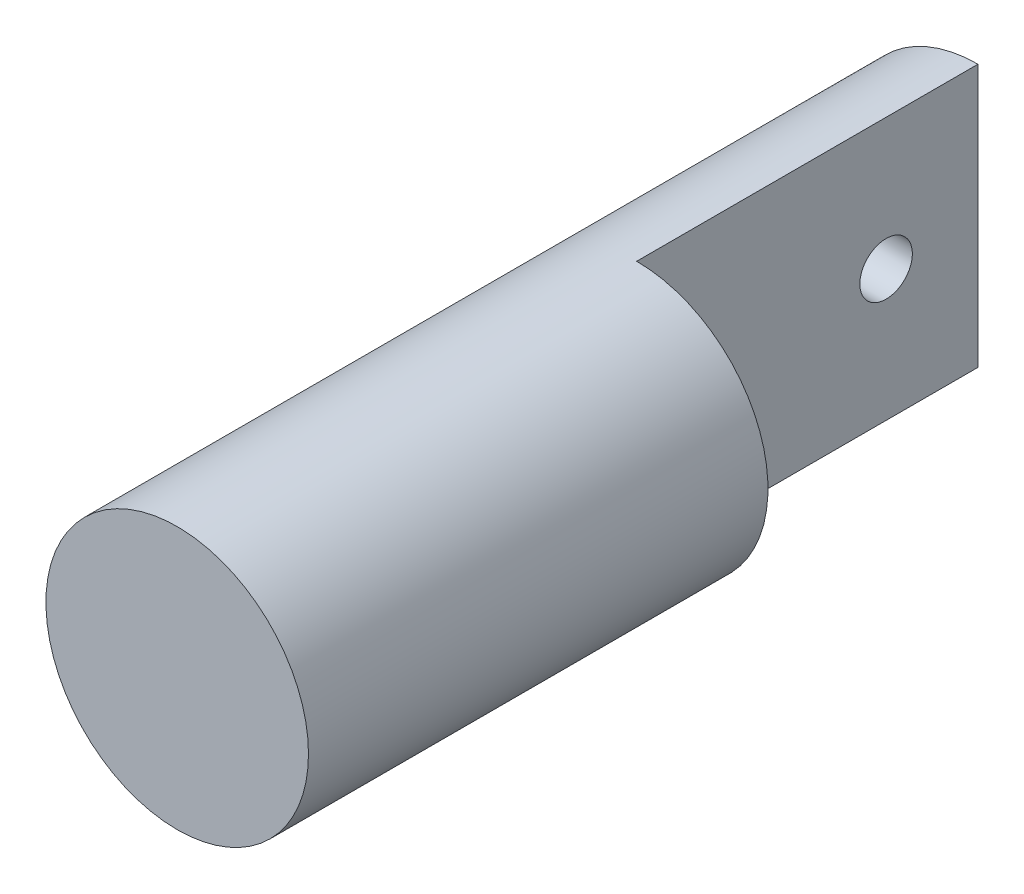
ISO-10303-21;
HEADER;
FILE_DESCRIPTION(('STEP AP214'),'2;1');
FILE_NAME('part.step','',(''),(''),'','','');
FILE_SCHEMA(('AUTOMOTIVE_DESIGN { 1 0 10303 214 1 1 1 1 }'));
ENDSEC;
DATA;
#1=APPLICATION_CONTEXT('core data for automotive mechanical design processes');
#2=APPLICATION_PROTOCOL_DEFINITION('international standard','automotive_design',2000,#1);
#3=PRODUCT_CONTEXT('',#1,'mechanical');
#4=PRODUCT('Part','Part','',(#3));
#5=PRODUCT_RELATED_PRODUCT_CATEGORY('part','',(#4));
#6=PRODUCT_DEFINITION_FORMATION('','',#4);
#7=PRODUCT_DEFINITION_CONTEXT('part definition',#1,'design');
#8=PRODUCT_DEFINITION('design','',#6,#7);
#9=PRODUCT_DEFINITION_SHAPE('','',#8);
#10=(LENGTH_UNIT() NAMED_UNIT(*) SI_UNIT(.MILLI.,.METRE.));
#11=(NAMED_UNIT(*) PLANE_ANGLE_UNIT() SI_UNIT($,.RADIAN.));
#12=(NAMED_UNIT(*) SI_UNIT($,.STERADIAN.) SOLID_ANGLE_UNIT());
#13=UNCERTAINTY_MEASURE_WITH_UNIT(LENGTH_MEASURE(1.E-05),#10,'distance_accuracy_value','');
#14=(GEOMETRIC_REPRESENTATION_CONTEXT(3) GLOBAL_UNCERTAINTY_ASSIGNED_CONTEXT((#13)) GLOBAL_UNIT_ASSIGNED_CONTEXT((#10,
#11,#12)) REPRESENTATION_CONTEXT('',''));
#15=CARTESIAN_POINT('',(0.,0.,0.));
#16=DIRECTION('',(0.,0.,1.));
#17=DIRECTION('',(1.,0.,0.));
#18=AXIS2_PLACEMENT_3D('',#15,#16,#17);
#19=CARTESIAN_POINT('',(0.,0.,0.));
#20=DIRECTION('',(0.,0.,1.));
#21=DIRECTION('',(1.,0.,0.));
#22=AXIS2_PLACEMENT_3D('',#19,#20,#21);
#23=PLANE('',#22);
#24=CARTESIAN_POINT('',(0.,0.,0.));
#25=DIRECTION('',(0.,0.,1.));
#26=DIRECTION('',(1.,0.,0.));
#27=AXIS2_PLACEMENT_3D('',#24,#25,#26);
#28=CIRCLE('',#27,10.);
#29=CARTESIAN_POINT('',(0.,10.,0.));
#30=VERTEX_POINT('',#29);
#31=CARTESIAN_POINT('',(0.,-10.,0.));
#32=VERTEX_POINT('',#31);
#33=EDGE_CURVE('E54',#30,#32,#28,.T.);
#34=ORIENTED_EDGE('',*,*,#33,.F.);
#35=DIRECTION('',(0.,1.,0.));
#36=VECTOR('',#35,1.);
#37=CARTESIAN_POINT('',(0.,10.,0.));
#38=LINE('',#37,#36);
#39=EDGE_CURVE('E71',#32,#30,#38,.T.);
#40=ORIENTED_EDGE('',*,*,#39,.F.);
#41=EDGE_LOOP('',(#34,#40));
#42=FACE_BOUND('',#41,.T.);
#43=CARTESIAN_POINT('',(-5.,0.,0.));
#44=DIRECTION('',(0.,0.,-1.));
#45=DIRECTION('',(-1.,0.,0.));
#46=AXIS2_PLACEMENT_3D('',#43,#44,#45);
#47=CIRCLE('',#46,1.24999999999999);
#48=CARTESIAN_POINT('',(-6.24999999999999,0.,0.));
#49=VERTEX_POINT('',#48);
#50=EDGE_CURVE('E169',#49,#49,#47,.T.);
#51=ORIENTED_EDGE('',*,*,#50,.F.);
#52=EDGE_LOOP('',(#51));
#53=FACE_BOUND('',#52,.T.);
#54=ADVANCED_FACE('F45',(#42,#53),#23,.F.);
#55=CARTESIAN_POINT('',(0.,0.,27.));
#56=DIRECTION('',(0.,0.,-1.));
#57=DIRECTION('',(-1.,0.,0.));
#58=AXIS2_PLACEMENT_3D('',#55,#56,#57);
#59=CYLINDRICAL_SURFACE('',#58,10.);
#60=CARTESIAN_POINT('',(-10.,0.,5.));
#61=CARTESIAN_POINT('',(-9.99999795161742,0.111153813585266,5.00000408899669));
#62=CARTESIAN_POINT('',(-9.99812770356462,0.222359320403045,5.00929768593529));
#63=CARTESIAN_POINT('',(-9.99084731246463,0.441627015378039,5.04619700023049));
#64=CARTESIAN_POINT('',(-9.98543435720372,0.549686635082712,5.07381726560302));
#65=CARTESIAN_POINT('',(-9.97167298556573,0.759460610526626,5.14648254724158));
#66=CARTESIAN_POINT('',(-9.96332738153436,0.861180935866269,5.19151087368938));
#67=CARTESIAN_POINT('',(-9.94460796070629,1.05561597772845,5.29766449502259));
#68=CARTESIAN_POINT('',(-9.93423426471414,1.14833123015162,5.35878883121441));
#69=CARTESIAN_POINT('',(-9.9124433065994,1.32338695462973,5.49627698858287));
#70=CARTESIAN_POINT('',(-9.90101491008695,1.40558790231705,5.5728167107824));
#71=CARTESIAN_POINT('',(-9.87848360905177,1.55607351321606,5.73858483278341));
#72=CARTESIAN_POINT('',(-9.86738073000847,1.62435708954085,5.82781422267024));
#73=CARTESIAN_POINT('',(-9.8466488362523,1.74566350669524,6.01743238602375));
#74=CARTESIAN_POINT('',(-9.83703414729892,1.79854187773173,6.11791528759272));
#75=CARTESIAN_POINT('',(-9.82052536116836,1.88661133316062,6.32656363800816));
#76=CARTESIAN_POINT('',(-9.81363099523923,1.92180416487448,6.43472832669269));
#77=CARTESIAN_POINT('',(-9.80345610504409,1.97305059976965,6.65416872781583));
#78=CARTESIAN_POINT('',(-9.80012940214375,1.98934899591755,6.76538508828445));
#79=CARTESIAN_POINT('',(-9.79732750121254,2.00310425545224,6.98901964272868));
#80=CARTESIAN_POINT('',(-9.79785190935681,2.000563045427,7.10143771264029));
#81=CARTESIAN_POINT('',(-9.80265102296369,1.97690914620364,7.32249357604201));
#82=CARTESIAN_POINT('',(-9.80686905717527,1.95607708048781,7.43116281125463));
#83=CARTESIAN_POINT('',(-9.81849092320002,1.8968757692461,7.64343215332601));
#84=CARTESIAN_POINT('',(-9.82589490715558,1.85850568620136,7.74703201783802));
#85=CARTESIAN_POINT('',(-9.84311237000816,1.76504956734944,7.9470305234072));
#86=CARTESIAN_POINT('',(-9.85294179627409,1.70985230246423,8.04337575913834));
#87=CARTESIAN_POINT('',(-9.87389237546124,1.58438714914536,8.22554169994563));
#88=CARTESIAN_POINT('',(-9.88501367676732,1.51411752871366,8.31136119370231));
#89=CARTESIAN_POINT('',(-9.90754042482924,1.35899986912117,8.47165880491387));
#90=CARTESIAN_POINT('',(-9.9189473842181,1.27391232242489,8.54590513571826));
#91=CARTESIAN_POINT('',(-9.94057697428817,1.09237004812402,8.67910769260245));
#92=CARTESIAN_POINT('',(-9.95079958977947,0.995915174758779,8.73806372258716));
#93=CARTESIAN_POINT('',(-9.96893380321774,0.794118773757842,8.83905501845195));
#94=CARTESIAN_POINT('',(-9.97684177696544,0.688763639170601,8.88106378728907));
#95=CARTESIAN_POINT('',(-9.98942817975716,0.47229795289733,8.94672094807713));
#96=CARTESIAN_POINT('',(-9.99410700001063,0.3611881001449,8.97037156414726));
#97=CARTESIAN_POINT('',(-9.99965343733735,0.138358811254301,8.99831290758855));
#98=CARTESIAN_POINT('',(-10.0005834930494,0.0266806566511525,9.00292083908054));
#99=CARTESIAN_POINT('',(-9.99870103860205,-0.195849868385428,8.99350028211564));
#100=CARTESIAN_POINT('',(-9.99588873882892,-0.306702284887587,8.97947284129481));
#101=CARTESIAN_POINT('',(-9.98687664016035,-0.523411319893082,8.93344325291209));
#102=CARTESIAN_POINT('',(-9.98070752808413,-0.629303896679806,8.90160386300419));
#103=CARTESIAN_POINT('',(-9.96567104122065,-0.834247254999334,8.82103203468838));
#104=CARTESIAN_POINT('',(-9.95680346428453,-0.933297523275079,8.77229833064634));
#105=CARTESIAN_POINT('',(-9.93719823066589,-1.12308234737244,8.65863501869738));
#106=CARTESIAN_POINT('',(-9.92643900874104,-1.21370025350438,8.59351443792211));
#107=CARTESIAN_POINT('',(-9.90429469659765,-1.38283603823841,8.44918161758544));
#108=CARTESIAN_POINT('',(-9.89290953936776,-1.46135261786152,8.36996786720027));
#109=CARTESIAN_POINT('',(-9.8705860711393,-1.60528118154835,8.19825329621775));
#110=CARTESIAN_POINT('',(-9.85965720466609,-1.67047540489731,8.10556851155732));
#111=CARTESIAN_POINT('',(-9.83968383592389,-1.78437084010241,7.91037727728664));
#112=CARTESIAN_POINT('',(-9.83063925826685,-1.83307271184581,7.80787122085289));
#113=CARTESIAN_POINT('',(-9.81553481168766,-1.91230368316392,7.5964635077009));
#114=CARTESIAN_POINT('',(-9.80945949744373,-1.9429269995821,7.48759831757936));
#115=CARTESIAN_POINT('',(-9.8009487358405,-1.98541730325439,7.26613309301819));
#116=CARTESIAN_POINT('',(-9.79851281382223,-1.99728673645023,7.15353354758131));
#117=CARTESIAN_POINT('',(-9.79758299262758,-2.00184182173494,6.92998227091136));
#118=CARTESIAN_POINT('',(-9.79901838378602,-1.99487157614179,6.81903770214598));
#119=CARTESIAN_POINT('',(-9.80551146969228,-1.96270460820012,6.59993670018995));
#120=CARTESIAN_POINT('',(-9.81056913534338,-1.9375080322586,6.49178024461039));
#121=CARTESIAN_POINT('',(-9.82370528438317,-1.86975713699791,6.28154457751891));
#122=CARTESIAN_POINT('',(-9.83177642037661,-1.82724501343469,6.17945127899517));
#123=CARTESIAN_POINT('',(-9.85003429948341,-1.72610928920321,5.98379255853112));
#124=CARTESIAN_POINT('',(-9.86022121997788,-1.66748433754976,5.89022785254972));
#125=CARTESIAN_POINT('',(-9.88177921046451,-1.53461182957283,5.71256885569937));
#126=CARTESIAN_POINT('',(-9.89316745819399,-1.46011577447036,5.62866246946481));
#127=CARTESIAN_POINT('',(-9.91572163743909,-1.29812873802628,5.47442758894166));
#128=CARTESIAN_POINT('',(-9.92688751726369,-1.21063477430667,5.40410221936546));
#129=CARTESIAN_POINT('',(-9.94787664775943,-1.02403525817649,5.27833071210711));
#130=CARTESIAN_POINT('',(-9.95768462438492,-0.92481776885967,5.22304799343995));
#131=CARTESIAN_POINT('',(-9.9747025017,-0.718332721881465,5.13002775480682));
#132=CARTESIAN_POINT('',(-9.98191474277232,-0.611072521726253,5.09227442093502));
#133=CARTESIAN_POINT('',(-9.99152745190741,-0.41964297784756,5.04269610391057));
#134=CARTESIAN_POINT('',(-9.99468606316904,-0.33656332802757,5.02671361258449));
#135=CARTESIAN_POINT('',(-9.99892308279786,-0.168999050420135,5.00536417528327));
#136=CARTESIAN_POINT('',(-10.0000015574631,-0.0845144674972385,4.99999689098046));
#137=CARTESIAN_POINT('',(-10.,0.,5.));
#138=B_SPLINE_CURVE_WITH_KNOTS('',3,(#60,#61,#62,#63,#64,#65,#66,#67,#68,#69,#70,#71,#72,#73,
#74,#75,#76,#77,#78,#79,#80,#81,#82,#83,#84,#85,#86,#87,#88,#89,#90,#91,#92,#93,#94,#95,#96,#97,
#98,#99,#100,#101,#102,#103,#104,#105,#106,#107,#108,#109,#110,#111,#112,#113,#114,#115,#116,
#117,#118,#119,#120,#121,#122,#123,#124,#125,#126,#127,#128,#129,#130,#131,#132,#133,#134,#135,
#136,#137),.UNSPECIFIED.,.T.,.F.,(4,2,2,2,2,2,2,2,2,2,2,2,2,2,2,2,2,2,2,2,2,2,2,2,2,2,2,2,2,2,2,
2,2,2,2,2,2,2,4),(0.,0.333152261322517,0.666569301382646,0.999667470500684,1.33274580446173,
1.66986534022437,2.00701119349473,2.34722390011846,2.68740298730395,3.02312370207175,
3.3588100856245,3.68943454012557,4.02007478507459,4.35294980407185,4.68586309499341,
5.02476504982701,5.3636713507964,5.70310549708048,6.04249851396072,6.3762147135253,
6.70991215315735,7.04060907901447,7.37133078432045,7.70610132066717,8.0409077669186,
8.38081257158452,8.72070377446933,9.05880762065446,9.39686736660829,9.72879445135403,
10.0607188698522,10.3918392250622,10.7229873516373,11.0597615247829,11.3966130906586,
11.7369899335127,12.0770591103504,12.3303755057979,12.5836838274199),.UNSPECIFIED.);
#139=CARTESIAN_POINT('',(-10.,0.,5.));
#140=VERTEX_POINT('',#139);
#141=EDGE_CURVE('E90',#140,#140,#138,.T.);
#142=ORIENTED_EDGE('',*,*,#141,.T.);
#143=EDGE_LOOP('',(#142));
#144=FACE_BOUND('',#143,.T.);
#145=DIRECTION('',(0.,0.,-1.));
#146=VECTOR('',#145,1.);
#147=CARTESIAN_POINT('',(0.,-10.,26.));
#148=LINE('',#147,#146);
#149=CARTESIAN_POINT('',(0.,-10.,26.));
#150=VERTEX_POINT('',#149);
#151=EDGE_CURVE('E61',#150,#32,#148,.T.);
#152=ORIENTED_EDGE('',*,*,#151,.F.);
#153=CARTESIAN_POINT('',(0.,0.,26.));
#154=DIRECTION('',(0.,0.,-1.));
#155=DIRECTION('',(-1.,0.,0.));
#156=AXIS2_PLACEMENT_3D('',#153,#154,#155);
#157=CIRCLE('',#156,10.);
#158=CARTESIAN_POINT('',(0.,10.,26.));
#159=VERTEX_POINT('',#158);
#160=EDGE_CURVE('E11',#159,#150,#157,.T.);
#161=ORIENTED_EDGE('',*,*,#160,.F.);
#162=DIRECTION('',(0.,0.,-1.));
#163=VECTOR('',#162,1.);
#164=CARTESIAN_POINT('',(0.,10.,26.));
#165=LINE('',#164,#163);
#166=EDGE_CURVE('E74',#159,#30,#165,.T.);
#167=ORIENTED_EDGE('',*,*,#166,.T.);
#168=ORIENTED_EDGE('',*,*,#33,.T.);
#169=EDGE_LOOP('',(#152,#161,#167,#168));
#170=FACE_BOUND('',#169,.T.);
#171=CARTESIAN_POINT('',(0.,0.,61.));
#172=DIRECTION('',(0.,0.,1.));
#173=DIRECTION('',(1.,0.,0.));
#174=AXIS2_PLACEMENT_3D('',#171,#172,#173);
#175=CIRCLE('',#174,10.);
#176=CARTESIAN_POINT('',(10.,0.,61.));
#177=VERTEX_POINT('',#176);
#178=EDGE_CURVE('E79',#177,#177,#175,.T.);
#179=ORIENTED_EDGE('',*,*,#178,.F.);
#180=EDGE_LOOP('',(#179));
#181=FACE_BOUND('',#180,.T.);
#182=ADVANCED_FACE('F47',(#144,#170,#181),#59,.T.);
#183=CARTESIAN_POINT('',(0.,0.,26.));
#184=DIRECTION('',(0.,0.,-1.));
#185=DIRECTION('',(-1.,0.,0.));
#186=AXIS2_PLACEMENT_3D('',#183,#184,#185);
#187=PLANE('',#186);
#188=DIRECTION('',(0.,1.,0.));
#189=VECTOR('',#188,1.);
#190=CARTESIAN_POINT('',(0.,10.,26.));
#191=LINE('',#190,#189);
#192=EDGE_CURVE('E78',#150,#159,#191,.T.);
#193=ORIENTED_EDGE('',*,*,#192,.T.);
#194=ORIENTED_EDGE('',*,*,#160,.T.);
#195=EDGE_LOOP('',(#193,#194));
#196=FACE_BOUND('',#195,.T.);
#197=ADVANCED_FACE('F112',(#196),#187,.T.);
#198=CARTESIAN_POINT('',(0.,10.,26.));
#199=DIRECTION('',(-1.,0.,0.));
#200=DIRECTION('',(0.,-1.,0.));
#201=AXIS2_PLACEMENT_3D('',#198,#199,#200);
#202=PLANE('',#201);
#203=CARTESIAN_POINT('',(0.,0.,7.));
#204=DIRECTION('',(1.,0.,0.));
#205=DIRECTION('',(0.,0.,-1.));
#206=AXIS2_PLACEMENT_3D('',#203,#204,#205);
#207=CIRCLE('',#206,2.);
#208=CARTESIAN_POINT('',(0.,0.,5.));
#209=VERTEX_POINT('',#208);
#210=EDGE_CURVE('E97',#209,#209,#207,.T.);
#211=ORIENTED_EDGE('',*,*,#210,.F.);
#212=EDGE_LOOP('',(#211));
#213=FACE_BOUND('',#212,.T.);
#214=ORIENTED_EDGE('',*,*,#39,.T.);
#215=ORIENTED_EDGE('',*,*,#166,.F.);
#216=ORIENTED_EDGE('',*,*,#192,.F.);
#217=ORIENTED_EDGE('',*,*,#151,.T.);
#218=EDGE_LOOP('',(#214,#215,#216,#217));
#219=FACE_BOUND('',#218,.T.);
#220=ADVANCED_FACE('F73',(#213,#219),#202,.F.);
#221=CARTESIAN_POINT('',(0.,0.,61.));
#222=DIRECTION('',(0.,0.,1.));
#223=DIRECTION('',(1.,0.,0.));
#224=AXIS2_PLACEMENT_3D('',#221,#222,#223);
#225=PLANE('',#224);
#226=ORIENTED_EDGE('',*,*,#178,.T.);
#227=EDGE_LOOP('',(#226));
#228=FACE_BOUND('',#227,.T.);
#229=ADVANCED_FACE('F105',(#228),#225,.T.);
#230=CARTESIAN_POINT('',(-10.,0.,7.));
#231=DIRECTION('',(1.,0.,0.));
#232=DIRECTION('',(0.,0.,-1.));
#233=AXIS2_PLACEMENT_3D('',#230,#231,#232);
#234=CYLINDRICAL_SURFACE('',#233,2.);
#235=CARTESIAN_POINT('',(-6.24999999999999,0.,5.));
#236=CARTESIAN_POINT('',(-6.24999565000121,0.0635104730002023,5.00000404694687));
#237=CARTESIAN_POINT('',(-6.24512698818218,0.127096441053757,5.00305676688999));
#238=CARTESIAN_POINT('',(-6.22591419657049,0.252318262265281,5.01497832275898));
#239=CARTESIAN_POINT('',(-6.21155200607451,0.313950163299071,5.02385824425104));
#240=CARTESIAN_POINT('',(-6.17418863683794,0.43320555813678,5.04654147017866));
#241=CARTESIAN_POINT('',(-6.15123021215911,0.490847243665014,5.06032039221337));
#242=CARTESIAN_POINT('',(-6.09761414920324,0.601260368868357,5.09165401513927));
#243=CARTESIAN_POINT('',(-6.0669573639908,0.654032347276149,5.10920829764729));
#244=CARTESIAN_POINT('',(-5.99611342681502,0.757974192167969,5.14829847097727));
#245=CARTESIAN_POINT('',(-5.95536070002454,0.808679560769973,5.17004037775383));
#246=CARTESIAN_POINT('',(-5.86678082549344,0.902986375146755,5.21468650086368));
#247=CARTESIAN_POINT('',(-5.81894417174206,0.946578107215729,5.23759225141447));
#248=CARTESIAN_POINT('',(-5.70996610579548,1.03142873237132,5.28569581344801));
#249=CARTESIAN_POINT('',(-5.64790021339272,1.0715720602915,5.31078389006588));
#250=CARTESIAN_POINT('',(-5.51643518455281,1.14073966020039,5.35669801871269));
#251=CARTESIAN_POINT('',(-5.44704868742392,1.16978270899534,5.37753124003761));
#252=CARTESIAN_POINT('',(-5.32118947622128,1.2093340058598,5.40690424372635));
#253=CARTESIAN_POINT('',(-5.26603318146118,1.22269552371393,5.41723094009926));
#254=CARTESIAN_POINT('',(-5.1536940743892,1.24181843585479,5.43218642674194));
#255=CARTESIAN_POINT('',(-5.09651424172551,1.24759056342087,5.43682326326307));
#256=CARTESIAN_POINT('',(-4.98158698324888,1.25118918245719,5.43970114217172));
#257=CARTESIAN_POINT('',(-4.9238384635376,1.2489948372785,5.43792541228281));
#258=CARTESIAN_POINT('',(-4.80968989681104,1.23676317046804,5.4282259761608));
#259=CARTESIAN_POINT('',(-4.75329096796092,1.22671956265043,5.42029734232889));
#260=CARTESIAN_POINT('',(-4.64456154734252,1.19968103371473,5.39967426878219));
#261=CARTESIAN_POINT('',(-4.59216754431573,1.18285016736896,5.38709284895186));
#262=CARTESIAN_POINT('',(-4.49083881759458,1.14290189820937,5.35854433556594));
#263=CARTESIAN_POINT('',(-4.4419053251255,1.11978227193695,5.34257604498646));
#264=CARTESIAN_POINT('',(-4.33916672616726,1.06294892954948,5.3054518400698));
#265=CARTESIAN_POINT('',(-4.28615918987961,1.0280629660117,5.2838840842404));
#266=CARTESIAN_POINT('',(-4.18616972099952,0.950881463002094,5.23994288208756));
#267=CARTESIAN_POINT('',(-4.13919406829348,0.90857830801143,5.21756862664024));
#268=CARTESIAN_POINT('',(-4.04469825062961,0.809519713023324,5.17020105083143));
#269=CARTESIAN_POINT('',(-3.99836702574117,0.751531353595326,5.14538468323407));
#270=CARTESIAN_POINT('',(-3.91614910411276,0.627148099593563,5.09971944937555));
#271=CARTESIAN_POINT('',(-3.88025830227108,0.560756523881992,5.07886902485236));
#272=CARTESIAN_POINT('',(-3.82223631161858,0.424883562934742,5.04446627038684));
#273=CARTESIAN_POINT('',(-3.79946596001882,0.355763457732365,5.03058023408426));
#274=CARTESIAN_POINT('',(-3.76623507201719,0.213612154574971,5.01015070689952));
#275=CARTESIAN_POINT('',(-3.755757105778,0.1405866483413,5.0035968200993));
#276=CARTESIAN_POINT('',(-3.74843414993881,0.00451561874058533,4.99902159459909));
#277=CARTESIAN_POINT('',(-3.74979682204615,-0.0584027741637875,4.99987838654489));
#278=CARTESIAN_POINT('',(-3.76188282842073,-0.182972117996311,5.00741098505673));
#279=CARTESIAN_POINT('',(-3.77260552509217,-0.244623154962735,5.01408639526409));
#280=CARTESIAN_POINT('',(-3.80223853669197,-0.362521070658191,5.0322594771693));
#281=CARTESIAN_POINT('',(-3.82081215679665,-0.418885009953205,5.04355829473156));
#282=CARTESIAN_POINT('',(-3.86529638927857,-0.527638281070988,5.07004315895249));
#283=CARTESIAN_POINT('',(-3.89120823025516,-0.580026945470715,5.08522985649734));
#284=CARTESIAN_POINT('',(-3.95251520599549,-0.685084056277256,5.12009987644));
#285=CARTESIAN_POINT('',(-3.98860356923824,-0.737246967843403,5.14008235182775));
#286=CARTESIAN_POINT('',(-4.06779386515281,-0.835142640217339,5.18193029998283));
#287=CARTESIAN_POINT('',(-4.11090358925454,-0.880868151291853,5.20379785173616));
#288=CARTESIAN_POINT('',(-4.21013503941266,-0.971474198022881,5.25094130286909));
#289=CARTESIAN_POINT('',(-4.26723720629479,-1.01526851939752,5.27625116585043));
#290=CARTESIAN_POINT('',(-4.38887578494426,-1.09280351885684,5.32433237251828));
#291=CARTESIAN_POINT('',(-4.453407006753,-1.12655115718693,5.34710546677663));
#292=CARTESIAN_POINT('',(-4.57469214805688,-1.17684772011827,5.38266469685408));
#293=CARTESIAN_POINT('',(-4.63024075073222,-1.19551895865479,5.3965436380622));
#294=CARTESIAN_POINT('',(-4.74439314576892,-1.22500108205244,5.41894969336232));
#295=CARTESIAN_POINT('',(-4.80299200945147,-1.23582424983126,5.42748516757394));
#296=CARTESIAN_POINT('',(-4.92209027688069,-1.24901383653653,5.43793675011268));
#297=CARTESIAN_POINT('',(-4.98259858548818,-1.25133186963292,5.43981498325431));
#298=CARTESIAN_POINT('',(-5.10313096036604,-1.24719778716817,5.43650936890152));
#299=CARTESIAN_POINT('',(-5.16315485900952,-1.24074275650142,5.43132317404414));
#300=CARTESIAN_POINT('',(-5.27602979505136,-1.22038272403399,5.41544611228665));
#301=CARTESIAN_POINT('',(-5.32906930141641,-1.20711919499769,5.40523191948939));
#302=CARTESIAN_POINT('',(-5.43213505958591,-1.17417623469512,5.38082469564309));
#303=CARTESIAN_POINT('',(-5.4821600445375,-1.15449412799406,5.36663000576272));
#304=CARTESIAN_POINT('',(-5.5855967438727,-1.10602690439617,5.33336097113481));
#305=CARTESIAN_POINT('',(-5.63845029847655,-1.07633644455459,5.31387769501002));
#306=CARTESIAN_POINT('',(-5.738938367246,-1.01000017036389,5.27332293588132));
#307=CARTESIAN_POINT('',(-5.78656861256048,-0.973348732866933,5.25225017723174));
#308=CARTESIAN_POINT('',(-5.88501425497784,-0.885670221416053,5.20598089268818));
#309=CARTESIAN_POINT('',(-5.93459084544548,-0.833233674246787,5.18079458191223));
#310=CARTESIAN_POINT('',(-6.02449482970524,-0.719822446025197,5.13301270943252));
#311=CARTESIAN_POINT('',(-6.0648164959274,-0.658842515138542,5.11041875635605));
#312=CARTESIAN_POINT('',(-6.13477113012409,-0.529355399891401,5.07013289023452));
#313=CARTESIAN_POINT('',(-6.16438600540584,-0.460835727056563,5.05244928644643));
#314=CARTESIAN_POINT('',(-6.21107188433174,-0.318394712729493,5.02418478362157));
#315=CARTESIAN_POINT('',(-6.22818723486978,-0.244493501106844,5.01357878571311));
#316=CARTESIAN_POINT('',(-6.24229920916262,-0.141418481224658,5.00480527831857));
#317=CARTESIAN_POINT('',(-6.24518186533396,-0.113248608862865,5.00300827773699));
#318=CARTESIAN_POINT('',(-6.24903329153759,-0.0567241864870876,5.0006046978676));
#319=CARTESIAN_POINT('',(-6.25000194310999,-0.0283696251514516,4.99999819226089));
#320=CARTESIAN_POINT('',(-6.24999999999999,0.,5.));
#321=B_SPLINE_CURVE_WITH_KNOTS('',3,(#235,#236,#237,#238,#239,#240,#241,#242,#243,#244,#245,
#246,#247,#248,#249,#250,#251,#252,#253,#254,#255,#256,#257,#258,#259,#260,#261,#262,#263,#264,
#265,#266,#267,#268,#269,#270,#271,#272,#273,#274,#275,#276,#277,#278,#279,#280,#281,#282,#283,
#284,#285,#286,#287,#288,#289,#290,#291,#292,#293,#294,#295,#296,#297,#298,#299,#300,#301,#302,
#303,#304,#305,#306,#307,#308,#309,#310,#311,#312,#313,#314,#315,#316,#317,#318,#319,#320),
.UNSPECIFIED.,.T.,.F.,(4,2,2,2,2,2,2,2,2,2,2,2,2,2,2,2,2,2,2,2,2,2,2,2,2,2,2,2,2,2,2,2,2,2,2,2,
2,2,2,2,2,2,4),(0.,0.190412301434132,0.38118789412846,0.571026987595133,0.760845054038792,
0.965821870536214,1.17107628325701,1.40412975852973,1.63678724607009,1.80912008879716,
1.9812089470739,2.15374823498777,2.32642584505082,2.49515839460435,2.66395067908032,
2.86427450354358,3.0648052257518,3.2984218069952,3.53194640727859,3.75284174135957,
3.97342347958129,4.16127180597571,4.34910733732278,4.52959504531296,4.71011298928464,
4.9088523099055,5.10781368827683,5.3356570886371,5.56334227196908,5.74329940313717,
5.92297427413349,6.10366974688197,6.2844252756386,6.45063169037737,6.61690747313439,
6.80725523036975,6.99775741153766,7.22600539035108,7.45439424578496,7.68316725607074,
7.91112460944404,7.99617501232476,8.08123067890583),.UNSPECIFIED.);
#322=CARTESIAN_POINT('',(-6.24999999999999,0.,5.));
#323=VERTEX_POINT('',#322);
#324=EDGE_CURVE('E163',#323,#323,#321,.T.);
#325=ORIENTED_EDGE('',*,*,#324,.T.);
#326=EDGE_LOOP('',(#325));
#327=FACE_BOUND('',#326,.T.);
#328=ORIENTED_EDGE('',*,*,#210,.T.);
#329=EDGE_LOOP('',(#328));
#330=FACE_BOUND('',#329,.T.);
#331=ORIENTED_EDGE('',*,*,#141,.F.);
#332=EDGE_LOOP('',(#331));
#333=FACE_BOUND('',#332,.T.);
#334=ADVANCED_FACE('F99',(#327,#330,#333),#234,.F.);
#335=CARTESIAN_POINT('',(-5.,0.,0.));
#336=DIRECTION('',(0.,0.,-1.));
#337=DIRECTION('',(-1.,0.,0.));
#338=AXIS2_PLACEMENT_3D('',#335,#336,#337);
#339=CYLINDRICAL_SURFACE('',#338,1.24999999999999);
#340=ORIENTED_EDGE('',*,*,#324,.F.);
#341=EDGE_LOOP('',(#340));
#342=FACE_BOUND('',#341,.T.);
#343=ORIENTED_EDGE('',*,*,#50,.T.);
#344=EDGE_LOOP('',(#343));
#345=FACE_BOUND('',#344,.T.);
#346=ADVANCED_FACE('F104',(#342,#345),#339,.F.);
#347=CLOSED_SHELL('',(#54,#182,#197,#220,#229,#334,#346));
#348=MANIFOLD_SOLID_BREP('B2',#347);
#349=ADVANCED_BREP_SHAPE_REPRESENTATION('',(#18,#348),#14);
#350=SHAPE_DEFINITION_REPRESENTATION(#9,#349);
ENDSEC;
END-ISO-10303-21;
